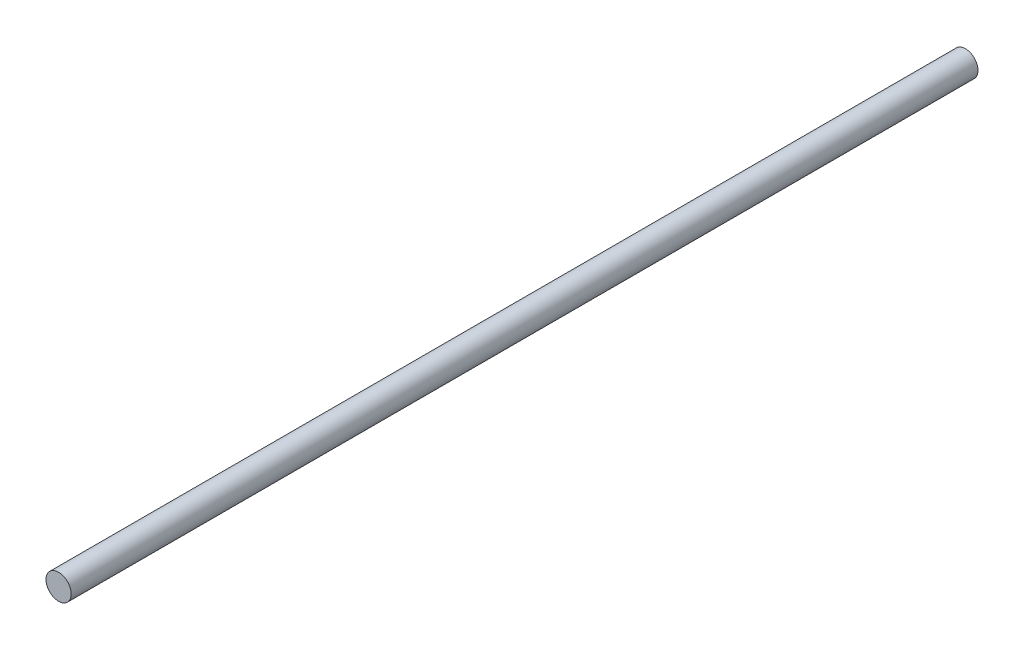
ISO-10303-21;
HEADER;
FILE_DESCRIPTION(('STEP AP214'),'2;1');
FILE_NAME('part.step','',(''),(''),'','','');
FILE_SCHEMA(('AUTOMOTIVE_DESIGN { 1 0 10303 214 1 1 1 1 }'));
ENDSEC;
DATA;
#1=APPLICATION_CONTEXT('core data for automotive mechanical design processes');
#2=APPLICATION_PROTOCOL_DEFINITION('international standard','automotive_design',2000,#1);
#3=PRODUCT_CONTEXT('',#1,'mechanical');
#4=PRODUCT('Part','Part','',(#3));
#5=PRODUCT_RELATED_PRODUCT_CATEGORY('part','',(#4));
#6=PRODUCT_DEFINITION_FORMATION('','',#4);
#7=PRODUCT_DEFINITION_CONTEXT('part definition',#1,'design');
#8=PRODUCT_DEFINITION('design','',#6,#7);
#9=PRODUCT_DEFINITION_SHAPE('','',#8);
#10=(LENGTH_UNIT() NAMED_UNIT(*) SI_UNIT(.MILLI.,.METRE.));
#11=(NAMED_UNIT(*) PLANE_ANGLE_UNIT() SI_UNIT($,.RADIAN.));
#12=(NAMED_UNIT(*) SI_UNIT($,.STERADIAN.) SOLID_ANGLE_UNIT());
#13=UNCERTAINTY_MEASURE_WITH_UNIT(LENGTH_MEASURE(1.E-05),#10,'distance_accuracy_value','');
#14=(GEOMETRIC_REPRESENTATION_CONTEXT(3) GLOBAL_UNCERTAINTY_ASSIGNED_CONTEXT((#13)) GLOBAL_UNIT_ASSIGNED_CONTEXT((#10,
#11,#12)) REPRESENTATION_CONTEXT('',''));
#15=CARTESIAN_POINT('',(0.,0.,0.));
#16=DIRECTION('',(0.,0.,1.));
#17=DIRECTION('',(1.,0.,0.));
#18=AXIS2_PLACEMENT_3D('',#15,#16,#17);
#19=CARTESIAN_POINT('',(0.,0.,288.));
#20=DIRECTION('',(0.,0.,-1.));
#21=DIRECTION('',(-1.,0.,0.));
#22=AXIS2_PLACEMENT_3D('',#19,#20,#21);
#23=CYLINDRICAL_SURFACE('',#22,4.);
#24=CARTESIAN_POINT('',(0.,0.,288.));
#25=DIRECTION('',(0.,0.,1.));
#26=DIRECTION('',(1.,0.,0.));
#27=AXIS2_PLACEMENT_3D('',#24,#25,#26);
#28=CIRCLE('',#27,4.);
#29=CARTESIAN_POINT('',(4.,0.,288.));
#30=VERTEX_POINT('',#29);
#31=EDGE_CURVE('E10',#30,#30,#28,.T.);
#32=ORIENTED_EDGE('',*,*,#31,.F.);
#33=EDGE_LOOP('',(#32));
#34=FACE_BOUND('',#33,.T.);
#35=CARTESIAN_POINT('',(0.,0.,0.));
#36=DIRECTION('',(0.,0.,1.));
#37=DIRECTION('',(1.,0.,0.));
#38=AXIS2_PLACEMENT_3D('',#35,#36,#37);
#39=CIRCLE('',#38,4.);
#40=CARTESIAN_POINT('',(4.,0.,0.));
#41=VERTEX_POINT('',#40);
#42=EDGE_CURVE('E34',#41,#41,#39,.T.);
#43=ORIENTED_EDGE('',*,*,#42,.T.);
#44=EDGE_LOOP('',(#43));
#45=FACE_BOUND('',#44,.T.);
#46=ADVANCED_FACE('F31',(#34,#45),#23,.T.);
#47=CARTESIAN_POINT('',(0.,0.,288.));
#48=DIRECTION('',(0.,0.,1.));
#49=DIRECTION('',(1.,0.,0.));
#50=AXIS2_PLACEMENT_3D('',#47,#48,#49);
#51=PLANE('',#50);
#52=ORIENTED_EDGE('',*,*,#31,.T.);
#53=EDGE_LOOP('',(#52));
#54=FACE_BOUND('',#53,.T.);
#55=ADVANCED_FACE('F46',(#54),#51,.T.);
#56=CARTESIAN_POINT('',(0.,0.,0.));
#57=DIRECTION('',(0.,0.,1.));
#58=DIRECTION('',(1.,0.,0.));
#59=AXIS2_PLACEMENT_3D('',#56,#57,#58);
#60=PLANE('',#59);
#61=ORIENTED_EDGE('',*,*,#42,.F.);
#62=EDGE_LOOP('',(#61));
#63=FACE_BOUND('',#62,.T.);
#64=ADVANCED_FACE('F44',(#63),#60,.F.);
#65=CLOSED_SHELL('',(#46,#55,#64));
#66=MANIFOLD_SOLID_BREP('B2',#65);
#67=ADVANCED_BREP_SHAPE_REPRESENTATION('',(#18,#66),#14);
#68=SHAPE_DEFINITION_REPRESENTATION(#9,#67);
ENDSEC;
END-ISO-10303-21;
